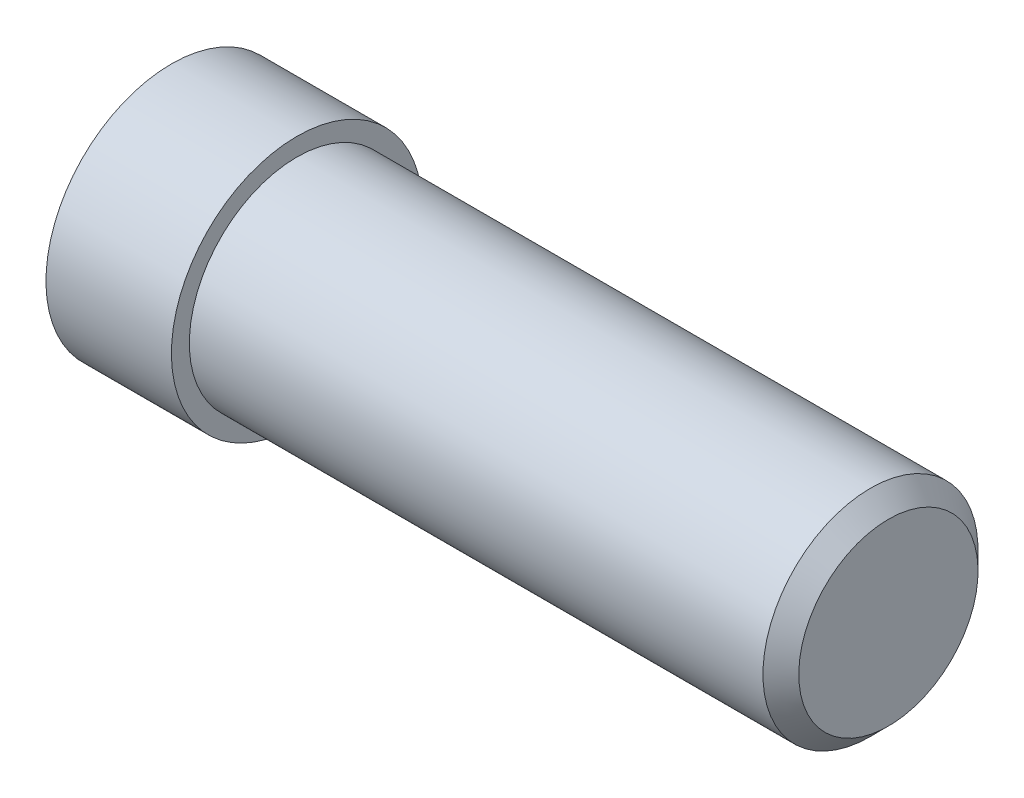
ISO-10303-21;
HEADER;
FILE_DESCRIPTION(('STEP AP214'),'2;1');
FILE_NAME('part.step','',(''),(''),'','','');
FILE_SCHEMA(('AUTOMOTIVE_DESIGN { 1 0 10303 214 1 1 1 1 }'));
ENDSEC;
DATA;
#1=APPLICATION_CONTEXT('core data for automotive mechanical design processes');
#2=APPLICATION_PROTOCOL_DEFINITION('international standard','automotive_design',2000,#1);
#3=PRODUCT_CONTEXT('',#1,'mechanical');
#4=PRODUCT('Part','Part','',(#3));
#5=PRODUCT_RELATED_PRODUCT_CATEGORY('part','',(#4));
#6=PRODUCT_DEFINITION_FORMATION('','',#4);
#7=PRODUCT_DEFINITION_CONTEXT('part definition',#1,'design');
#8=PRODUCT_DEFINITION('design','',#6,#7);
#9=PRODUCT_DEFINITION_SHAPE('','',#8);
#10=(LENGTH_UNIT() NAMED_UNIT(*) SI_UNIT(.MILLI.,.METRE.));
#11=(NAMED_UNIT(*) PLANE_ANGLE_UNIT() SI_UNIT($,.RADIAN.));
#12=(NAMED_UNIT(*) SI_UNIT($,.STERADIAN.) SOLID_ANGLE_UNIT());
#13=UNCERTAINTY_MEASURE_WITH_UNIT(LENGTH_MEASURE(1.E-05),#10,'distance_accuracy_value','');
#14=(GEOMETRIC_REPRESENTATION_CONTEXT(3) GLOBAL_UNCERTAINTY_ASSIGNED_CONTEXT((#13)) GLOBAL_UNIT_ASSIGNED_CONTEXT((#10,
#11,#12)) REPRESENTATION_CONTEXT('',''));
#15=CARTESIAN_POINT('',(0.,0.,0.));
#16=DIRECTION('',(0.,0.,1.));
#17=DIRECTION('',(1.,0.,0.));
#18=AXIS2_PLACEMENT_3D('',#15,#16,#17);
#19=CARTESIAN_POINT('',(0.,6.,0.));
#20=DIRECTION('',(1.,0.,0.));
#21=DIRECTION('',(0.,1.,0.));
#22=AXIS2_PLACEMENT_3D('',#19,#20,#21);
#23=PLANE('',#22);
#24=CARTESIAN_POINT('',(0.,0.,0.));
#25=DIRECTION('',(1.,0.,0.));
#26=DIRECTION('',(0.,1.,0.));
#27=AXIS2_PLACEMENT_3D('',#24,#25,#26);
#28=CIRCLE('',#27,5.);
#29=CARTESIAN_POINT('',(0.,5.,0.));
#30=VERTEX_POINT('',#29);
#31=EDGE_CURVE('E48',#30,#30,#28,.T.);
#32=ORIENTED_EDGE('',*,*,#31,.T.);
#33=EDGE_LOOP('',(#32));
#34=FACE_BOUND('',#33,.T.);
#35=ADVANCED_FACE('F39',(#34),#23,.T.);
#36=CARTESIAN_POINT('',(-40.,0.,0.));
#37=DIRECTION('',(-1.,0.,0.));
#38=DIRECTION('',(0.,-1.,0.));
#39=AXIS2_PLACEMENT_3D('',#36,#37,#38);
#40=PLANE('',#39);
#41=CARTESIAN_POINT('',(-40.,0.,0.));
#42=DIRECTION('',(1.,0.,0.));
#43=DIRECTION('',(0.,1.,0.));
#44=AXIS2_PLACEMENT_3D('',#41,#42,#43);
#45=CIRCLE('',#44,7.);
#46=CARTESIAN_POINT('',(-40.,7.,0.));
#47=VERTEX_POINT('',#46);
#48=EDGE_CURVE('E53',#47,#47,#45,.T.);
#49=ORIENTED_EDGE('',*,*,#48,.F.);
#50=EDGE_LOOP('',(#49));
#51=FACE_BOUND('',#50,.T.);
#52=ADVANCED_FACE('F81',(#51),#40,.T.);
#53=CARTESIAN_POINT('',(0.,0.,0.));
#54=DIRECTION('',(1.,0.,0.));
#55=DIRECTION('',(0.,1.,0.));
#56=AXIS2_PLACEMENT_3D('',#53,#54,#55);
#57=CYLINDRICAL_SURFACE('',#56,7.);
#58=ORIENTED_EDGE('',*,*,#48,.T.);
#59=EDGE_LOOP('',(#58));
#60=FACE_BOUND('',#59,.T.);
#61=CARTESIAN_POINT('',(-33.,0.,0.));
#62=DIRECTION('',(1.,0.,0.));
#63=DIRECTION('',(0.,1.,0.));
#64=AXIS2_PLACEMENT_3D('',#61,#62,#63);
#65=CIRCLE('',#64,7.);
#66=CARTESIAN_POINT('',(-33.,7.,0.));
#67=VERTEX_POINT('',#66);
#68=EDGE_CURVE('E58',#67,#67,#65,.T.);
#69=ORIENTED_EDGE('',*,*,#68,.F.);
#70=EDGE_LOOP('',(#69));
#71=FACE_BOUND('',#70,.T.);
#72=ADVANCED_FACE('F73',(#60,#71),#57,.T.);
#73=CARTESIAN_POINT('',(-33.,7.,0.));
#74=DIRECTION('',(1.,0.,0.));
#75=DIRECTION('',(0.,1.,0.));
#76=AXIS2_PLACEMENT_3D('',#73,#74,#75);
#77=PLANE('',#76);
#78=ORIENTED_EDGE('',*,*,#68,.T.);
#79=EDGE_LOOP('',(#78));
#80=FACE_BOUND('',#79,.T.);
#81=CARTESIAN_POINT('',(-33.,0.,0.));
#82=DIRECTION('',(1.,0.,0.));
#83=DIRECTION('',(0.,1.,0.));
#84=AXIS2_PLACEMENT_3D('',#81,#82,#83);
#85=CIRCLE('',#84,6.);
#86=CARTESIAN_POINT('',(-33.,6.,0.));
#87=VERTEX_POINT('',#86);
#88=EDGE_CURVE('E64',#87,#87,#85,.T.);
#89=ORIENTED_EDGE('',*,*,#88,.F.);
#90=EDGE_LOOP('',(#89));
#91=FACE_BOUND('',#90,.T.);
#92=ADVANCED_FACE('F71',(#80,#91),#77,.T.);
#93=CARTESIAN_POINT('',(0.,0.,0.));
#94=DIRECTION('',(1.,0.,0.));
#95=DIRECTION('',(0.,1.,0.));
#96=AXIS2_PLACEMENT_3D('',#93,#94,#95);
#97=CYLINDRICAL_SURFACE('',#96,6.);
#98=CARTESIAN_POINT('',(-1.00000000000001,0.,0.));
#99=DIRECTION('',(1.,0.,0.));
#100=DIRECTION('',(0.,1.,0.));
#101=AXIS2_PLACEMENT_3D('',#98,#99,#100);
#102=CIRCLE('',#101,6.);
#103=CARTESIAN_POINT('',(-1.00000000000001,6.,0.));
#104=VERTEX_POINT('',#103);
#105=EDGE_CURVE('E10',#104,#104,#102,.F.);
#106=ORIENTED_EDGE('',*,*,#105,.T.);
#107=EDGE_LOOP('',(#106));
#108=FACE_BOUND('',#107,.T.);
#109=ORIENTED_EDGE('',*,*,#88,.T.);
#110=EDGE_LOOP('',(#109));
#111=FACE_BOUND('',#110,.T.);
#112=ADVANCED_FACE('F69',(#108,#111),#97,.T.);
#113=CARTESIAN_POINT('',(0.,0.,0.));
#114=DIRECTION('',(-1.,0.,0.));
#115=DIRECTION('',(0.,-1.,0.));
#116=AXIS2_PLACEMENT_3D('',#113,#114,#115);
#117=CONICAL_SURFACE('',#116,5.,0.785398163397445);
#118=ORIENTED_EDGE('',*,*,#105,.F.);
#119=EDGE_LOOP('',(#118));
#120=FACE_BOUND('',#119,.T.);
#121=ORIENTED_EDGE('',*,*,#31,.F.);
#122=EDGE_LOOP('',(#121));
#123=FACE_BOUND('',#122,.T.);
#124=ADVANCED_FACE('F42',(#120,#123),#117,.T.);
#125=CLOSED_SHELL('',(#35,#52,#72,#92,#112,#124));
#126=MANIFOLD_SOLID_BREP('B2',#125);
#127=ADVANCED_BREP_SHAPE_REPRESENTATION('',(#18,#126),#14);
#128=SHAPE_DEFINITION_REPRESENTATION(#9,#127);
ENDSEC;
END-ISO-10303-21;
